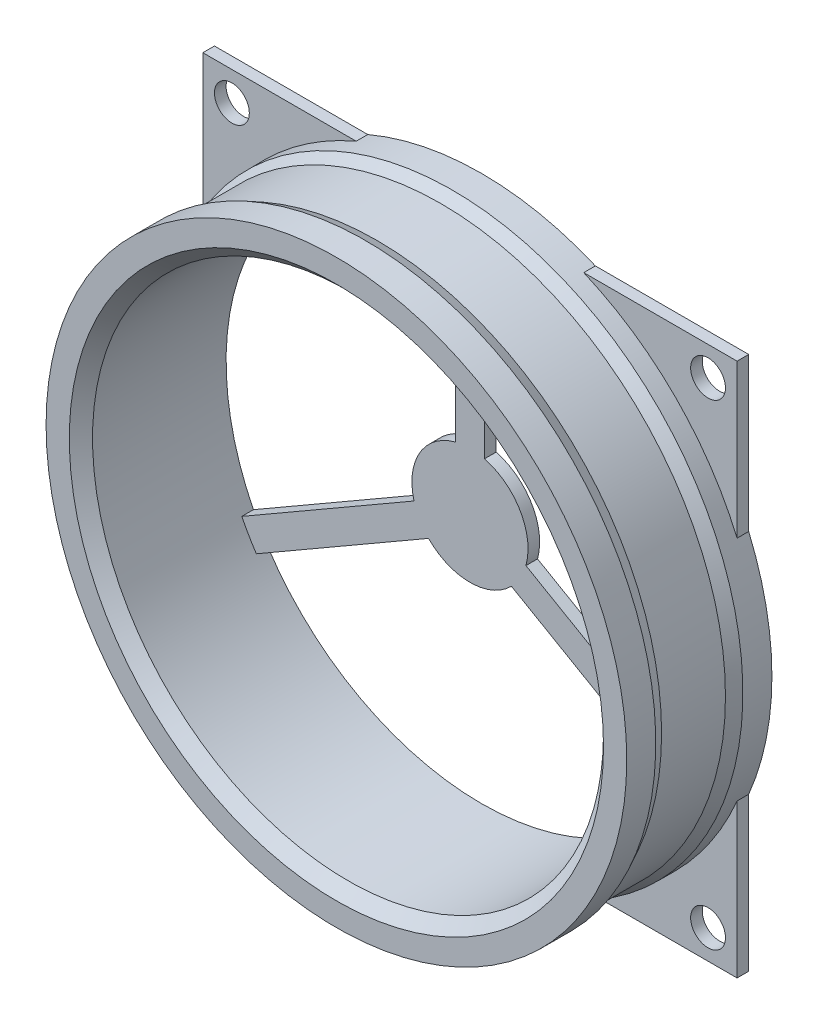
ISO-10303-21;
HEADER;
FILE_DESCRIPTION(('STEP AP214'),'2;1');
FILE_NAME('part.step','',(''),(''),'','','');
FILE_SCHEMA(('AUTOMOTIVE_DESIGN { 1 0 10303 214 1 1 1 1 }'));
ENDSEC;
DATA;
#1=APPLICATION_CONTEXT('core data for automotive mechanical design processes');
#2=APPLICATION_PROTOCOL_DEFINITION('international standard','automotive_design',2000,#1);
#3=PRODUCT_CONTEXT('',#1,'mechanical');
#4=PRODUCT('Part','Part','',(#3));
#5=PRODUCT_RELATED_PRODUCT_CATEGORY('part','',(#4));
#6=PRODUCT_DEFINITION_FORMATION('','',#4);
#7=PRODUCT_DEFINITION_CONTEXT('part definition',#1,'design');
#8=PRODUCT_DEFINITION('design','',#6,#7);
#9=PRODUCT_DEFINITION_SHAPE('','',#8);
#10=(LENGTH_UNIT() NAMED_UNIT(*) SI_UNIT(.MILLI.,.METRE.));
#11=(NAMED_UNIT(*) PLANE_ANGLE_UNIT() SI_UNIT($,.RADIAN.));
#12=(NAMED_UNIT(*) SI_UNIT($,.STERADIAN.) SOLID_ANGLE_UNIT());
#13=UNCERTAINTY_MEASURE_WITH_UNIT(LENGTH_MEASURE(1.E-05),#10,'distance_accuracy_value','');
#14=(GEOMETRIC_REPRESENTATION_CONTEXT(3) GLOBAL_UNCERTAINTY_ASSIGNED_CONTEXT((#13)) GLOBAL_UNIT_ASSIGNED_CONTEXT((#10,
#11,#12)) REPRESENTATION_CONTEXT('',''));
#15=CARTESIAN_POINT('',(0.,0.,0.));
#16=DIRECTION('',(0.,0.,1.));
#17=DIRECTION('',(1.,0.,0.));
#18=AXIS2_PLACEMENT_3D('',#15,#16,#17);
#19=CARTESIAN_POINT('',(0.,0.,25.));
#20=DIRECTION('',(0.,0.,-1.));
#21=DIRECTION('',(-1.,0.,0.));
#22=AXIS2_PLACEMENT_3D('',#19,#20,#21);
#23=CYLINDRICAL_SURFACE('',#22,50.);
#24=CARTESIAN_POINT('',(0.,0.,5.));
#25=DIRECTION('',(0.,0.,-1.));
#26=DIRECTION('',(-1.,0.,0.));
#27=AXIS2_PLACEMENT_3D('',#24,#25,#26);
#28=CIRCLE('',#27,50.);
#29=CARTESIAN_POINT('',(-50.,0.,5.));
#30=VERTEX_POINT('',#29);
#31=EDGE_CURVE('E677',#30,#30,#28,.T.);
#32=ORIENTED_EDGE('',*,*,#31,.T.);
#33=EDGE_LOOP('',(#32));
#34=FACE_BOUND('',#33,.T.);
#35=CARTESIAN_POINT('',(0.,0.,0.));
#36=DIRECTION('',(0.,0.,1.));
#37=DIRECTION('',(1.,0.,0.));
#38=AXIS2_PLACEMENT_3D('',#35,#36,#37);
#39=CIRCLE('',#38,50.);
#40=CARTESIAN_POINT('',(46.,-19.5959179422654,0.));
#41=VERTEX_POINT('',#40);
#42=CARTESIAN_POINT('',(46.,19.5959179422654,0.));
#43=VERTEX_POINT('',#42);
#44=EDGE_CURVE('E739',#41,#43,#39,.T.);
#45=ORIENTED_EDGE('',*,*,#44,.T.);
#46=DIRECTION('',(0.,0.,-1.));
#47=VECTOR('',#46,1.);
#48=CARTESIAN_POINT('',(46.,19.5959179422654,2.));
#49=LINE('',#48,#47);
#50=CARTESIAN_POINT('',(46.,19.5959179422654,2.));
#51=VERTEX_POINT('',#50);
#52=EDGE_CURVE('E435',#51,#43,#49,.T.);
#53=ORIENTED_EDGE('',*,*,#52,.F.);
#54=CARTESIAN_POINT('',(0.,0.,2.));
#55=DIRECTION('',(0.,0.,1.));
#56=DIRECTION('',(1.,0.,0.));
#57=AXIS2_PLACEMENT_3D('',#54,#55,#56);
#58=CIRCLE('',#57,50.);
#59=CARTESIAN_POINT('',(19.5959179422655,46.,2.));
#60=VERTEX_POINT('',#59);
#61=EDGE_CURVE('E420',#51,#60,#58,.T.);
#62=ORIENTED_EDGE('',*,*,#61,.T.);
#63=DIRECTION('',(0.,0.,-1.));
#64=VECTOR('',#63,1.);
#65=CARTESIAN_POINT('',(19.5959179422655,46.,2.));
#66=LINE('',#65,#64);
#67=CARTESIAN_POINT('',(19.5959179422655,46.,0.));
#68=VERTEX_POINT('',#67);
#69=EDGE_CURVE('E427',#60,#68,#66,.T.);
#70=ORIENTED_EDGE('',*,*,#69,.T.);
#71=CARTESIAN_POINT('',(-19.5959179422655,46.,0.));
#72=VERTEX_POINT('',#71);
#73=EDGE_CURVE('E491',#68,#72,#39,.T.);
#74=ORIENTED_EDGE('',*,*,#73,.T.);
#75=DIRECTION('',(0.,0.,-1.));
#76=VECTOR('',#75,1.);
#77=CARTESIAN_POINT('',(-19.5959179422655,46.,2.));
#78=LINE('',#77,#76);
#79=CARTESIAN_POINT('',(-19.5959179422655,46.,2.));
#80=VERTEX_POINT('',#79);
#81=EDGE_CURVE('E510',#80,#72,#78,.T.);
#82=ORIENTED_EDGE('',*,*,#81,.F.);
#83=CARTESIAN_POINT('',(0.,0.,2.));
#84=DIRECTION('',(0.,0.,1.));
#85=DIRECTION('',(1.,0.,0.));
#86=AXIS2_PLACEMENT_3D('',#83,#84,#85);
#87=CIRCLE('',#86,50.);
#88=CARTESIAN_POINT('',(-46.,19.5959179422655,2.));
#89=VERTEX_POINT('',#88);
#90=EDGE_CURVE('E492',#80,#89,#87,.T.);
#91=ORIENTED_EDGE('',*,*,#90,.T.);
#92=DIRECTION('',(0.,0.,-1.));
#93=VECTOR('',#92,1.);
#94=CARTESIAN_POINT('',(-46.,19.5959179422655,2.));
#95=LINE('',#94,#93);
#96=CARTESIAN_POINT('',(-46.,19.5959179422655,0.));
#97=VERTEX_POINT('',#96);
#98=EDGE_CURVE('E501',#89,#97,#95,.T.);
#99=ORIENTED_EDGE('',*,*,#98,.T.);
#100=CARTESIAN_POINT('',(-46.,-19.5959179422655,0.));
#101=VERTEX_POINT('',#100);
#102=EDGE_CURVE('E485',#97,#101,#39,.T.);
#103=ORIENTED_EDGE('',*,*,#102,.T.);
#104=DIRECTION('',(0.,0.,-1.));
#105=VECTOR('',#104,1.);
#106=CARTESIAN_POINT('',(-46.,-19.5959179422655,2.));
#107=LINE('',#106,#105);
#108=CARTESIAN_POINT('',(-46.,-19.5959179422655,2.));
#109=VERTEX_POINT('',#108);
#110=EDGE_CURVE('E477',#109,#101,#107,.T.);
#111=ORIENTED_EDGE('',*,*,#110,.F.);
#112=CARTESIAN_POINT('',(0.,0.,2.));
#113=DIRECTION('',(0.,0.,1.));
#114=DIRECTION('',(1.,0.,0.));
#115=AXIS2_PLACEMENT_3D('',#112,#113,#114);
#116=CIRCLE('',#115,50.);
#117=CARTESIAN_POINT('',(-19.5959179422654,-46.,2.));
#118=VERTEX_POINT('',#117);
#119=EDGE_CURVE('E460',#109,#118,#116,.T.);
#120=ORIENTED_EDGE('',*,*,#119,.T.);
#121=DIRECTION('',(0.,0.,-1.));
#122=VECTOR('',#121,1.);
#123=CARTESIAN_POINT('',(-19.5959179422654,-46.,2.));
#124=LINE('',#123,#122);
#125=CARTESIAN_POINT('',(-19.5959179422654,-46.,0.));
#126=VERTEX_POINT('',#125);
#127=EDGE_CURVE('E468',#118,#126,#124,.T.);
#128=ORIENTED_EDGE('',*,*,#127,.T.);
#129=CARTESIAN_POINT('',(19.5959179422654,-46.,0.));
#130=VERTEX_POINT('',#129);
#131=EDGE_CURVE('E490',#126,#130,#39,.T.);
#132=ORIENTED_EDGE('',*,*,#131,.T.);
#133=DIRECTION('',(0.,0.,-1.));
#134=VECTOR('',#133,1.);
#135=CARTESIAN_POINT('',(19.5959179422654,-46.,2.));
#136=LINE('',#135,#134);
#137=CARTESIAN_POINT('',(19.5959179422654,-46.,2.));
#138=VERTEX_POINT('',#137);
#139=EDGE_CURVE('E456',#138,#130,#136,.T.);
#140=ORIENTED_EDGE('',*,*,#139,.F.);
#141=CARTESIAN_POINT('',(0.,0.,2.));
#142=DIRECTION('',(0.,0.,1.));
#143=DIRECTION('',(1.,0.,0.));
#144=AXIS2_PLACEMENT_3D('',#141,#142,#143);
#145=CIRCLE('',#144,50.);
#146=CARTESIAN_POINT('',(46.,-19.5959179422654,2.));
#147=VERTEX_POINT('',#146);
#148=EDGE_CURVE('E439',#138,#147,#145,.T.);
#149=ORIENTED_EDGE('',*,*,#148,.T.);
#150=DIRECTION('',(0.,0.,-1.));
#151=VECTOR('',#150,1.);
#152=CARTESIAN_POINT('',(46.,-19.5959179422654,2.));
#153=LINE('',#152,#151);
#154=EDGE_CURVE('E447',#147,#41,#153,.T.);
#155=ORIENTED_EDGE('',*,*,#154,.T.);
#156=EDGE_LOOP('',(#45,#53,#62,#70,#74,#82,#91,#99,#103,#111,#120,#128,#132,#140,#149,#155));
#157=FACE_BOUND('',#156,.T.);
#158=ADVANCED_FACE('F221',(#34,#157),#23,.T.);
#159=CARTESIAN_POINT('',(0.,0.,25.));
#160=DIRECTION('',(0.,0.,-1.));
#161=DIRECTION('',(-1.,0.,0.));
#162=AXIS2_PLACEMENT_3D('',#159,#160,#161);
#163=CYLINDRICAL_SURFACE('',#162,44.);
#164=CARTESIAN_POINT('',(0.,0.,23.));
#165=DIRECTION('',(0.,0.,1.));
#166=DIRECTION('',(1.,0.,0.));
#167=AXIS2_PLACEMENT_3D('',#164,#165,#166);
#168=CIRCLE('',#167,44.);
#169=CARTESIAN_POINT('',(44.,0.,23.));
#170=VERTEX_POINT('',#169);
#171=EDGE_CURVE('E230',#170,#170,#168,.T.);
#172=ORIENTED_EDGE('',*,*,#171,.T.);
#173=EDGE_LOOP('',(#172));
#174=FACE_BOUND('',#173,.T.);
#175=CARTESIAN_POINT('',(0.,0.,2.));
#176=DIRECTION('',(0.,0.,1.));
#177=DIRECTION('',(1.,0.,0.));
#178=AXIS2_PLACEMENT_3D('',#175,#176,#177);
#179=CIRCLE('',#178,44.);
#180=CARTESIAN_POINT('',(2.5,43.9289198592454,2.));
#181=VERTEX_POINT('',#180);
#182=CARTESIAN_POINT('',(-2.5,43.9289198592454,2.));
#183=VERTEX_POINT('',#182);
#184=EDGE_CURVE('E397',#181,#183,#179,.T.);
#185=ORIENTED_EDGE('',*,*,#184,.F.);
#186=DIRECTION('',(0.,0.,-1.));
#187=VECTOR('',#186,1.);
#188=CARTESIAN_POINT('',(2.5,43.9289198592454,2.));
#189=LINE('',#188,#187);
#190=CARTESIAN_POINT('',(2.5,43.9289198592454,0.));
#191=VERTEX_POINT('',#190);
#192=EDGE_CURVE('E394',#181,#191,#189,.T.);
#193=ORIENTED_EDGE('',*,*,#192,.T.);
#194=CARTESIAN_POINT('',(0.,0.,0.));
#195=DIRECTION('',(0.,0.,1.));
#196=DIRECTION('',(1.,0.,0.));
#197=AXIS2_PLACEMENT_3D('',#194,#195,#196);
#198=CIRCLE('',#197,44.);
#199=CARTESIAN_POINT('',(39.2935605589172,-19.7993964201616,0.));
#200=VERTEX_POINT('',#199);
#201=EDGE_CURVE('E480',#200,#191,#198,.T.);
#202=ORIENTED_EDGE('',*,*,#201,.F.);
#203=DIRECTION('',(0.,0.,-1.));
#204=VECTOR('',#203,1.);
#205=CARTESIAN_POINT('',(39.2935605589172,-19.7993964201616,2.));
#206=LINE('',#205,#204);
#207=CARTESIAN_POINT('',(39.2935605589172,-19.7993964201616,2.));
#208=VERTEX_POINT('',#207);
#209=EDGE_CURVE('E710',#208,#200,#206,.T.);
#210=ORIENTED_EDGE('',*,*,#209,.F.);
#211=CARTESIAN_POINT('',(0.,0.,2.));
#212=DIRECTION('',(0.,0.,1.));
#213=DIRECTION('',(1.,0.,0.));
#214=AXIS2_PLACEMENT_3D('',#211,#212,#213);
#215=CIRCLE('',#214,44.);
#216=CARTESIAN_POINT('',(36.7935605589172,-24.1295234390838,2.));
#217=VERTEX_POINT('',#216);
#218=EDGE_CURVE('E692',#217,#208,#215,.T.);
#219=ORIENTED_EDGE('',*,*,#218,.F.);
#220=DIRECTION('',(0.,0.,-1.));
#221=VECTOR('',#220,1.);
#222=CARTESIAN_POINT('',(36.7935605589172,-24.1295234390838,2.));
#223=LINE('',#222,#221);
#224=CARTESIAN_POINT('',(36.7935605589172,-24.1295234390838,0.));
#225=VERTEX_POINT('',#224);
#226=EDGE_CURVE('E712',#217,#225,#223,.T.);
#227=ORIENTED_EDGE('',*,*,#226,.T.);
#228=CARTESIAN_POINT('',(-36.7935605589172,-24.1295234390838,0.));
#229=VERTEX_POINT('',#228);
#230=EDGE_CURVE('E487',#229,#225,#198,.T.);
#231=ORIENTED_EDGE('',*,*,#230,.F.);
#232=DIRECTION('',(0.,0.,-1.));
#233=VECTOR('',#232,1.);
#234=CARTESIAN_POINT('',(-36.7935605589172,-24.1295234390838,2.));
#235=LINE('',#234,#233);
#236=CARTESIAN_POINT('',(-36.7935605589172,-24.1295234390838,2.));
#237=VERTEX_POINT('',#236);
#238=EDGE_CURVE('E720',#237,#229,#235,.T.);
#239=ORIENTED_EDGE('',*,*,#238,.F.);
#240=CARTESIAN_POINT('',(0.,0.,2.));
#241=DIRECTION('',(0.,0.,1.));
#242=DIRECTION('',(1.,0.,0.));
#243=AXIS2_PLACEMENT_3D('',#240,#241,#242);
#244=CIRCLE('',#243,44.);
#245=CARTESIAN_POINT('',(-39.2935605589172,-19.7993964201616,2.));
#246=VERTEX_POINT('',#245);
#247=EDGE_CURVE('E685',#246,#237,#244,.T.);
#248=ORIENTED_EDGE('',*,*,#247,.F.);
#249=DIRECTION('',(0.,0.,-1.));
#250=VECTOR('',#249,1.);
#251=CARTESIAN_POINT('',(-39.2935605589172,-19.7993964201616,2.));
#252=LINE('',#251,#250);
#253=CARTESIAN_POINT('',(-39.2935605589172,-19.7993964201616,0.));
#254=VERTEX_POINT('',#253);
#255=EDGE_CURVE('E722',#246,#254,#252,.T.);
#256=ORIENTED_EDGE('',*,*,#255,.T.);
#257=CARTESIAN_POINT('',(-2.5,43.9289198592454,0.));
#258=VERTEX_POINT('',#257);
#259=EDGE_CURVE('E488',#258,#254,#198,.T.);
#260=ORIENTED_EDGE('',*,*,#259,.F.);
#261=DIRECTION('',(0.,0.,-1.));
#262=VECTOR('',#261,1.);
#263=CARTESIAN_POINT('',(-2.5,43.9289198592454,2.));
#264=LINE('',#263,#262);
#265=EDGE_CURVE('E416',#183,#258,#264,.T.);
#266=ORIENTED_EDGE('',*,*,#265,.F.);
#267=EDGE_LOOP('',(#185,#193,#202,#210,#219,#227,#231,#239,#248,#256,#260,#266));
#268=FACE_BOUND('',#267,.T.);
#269=ADVANCED_FACE('F516',(#174,#268),#163,.F.);
#270=CARTESIAN_POINT('',(0.,0.,20.));
#271=DIRECTION('',(0.,0.,-1.));
#272=DIRECTION('',(-1.,0.,0.));
#273=AXIS2_PLACEMENT_3D('',#270,#271,#272);
#274=CIRCLE('',#273,50.);
#275=CARTESIAN_POINT('',(-50.,0.,20.));
#276=VERTEX_POINT('',#275);
#277=EDGE_CURVE('E556',#276,#276,#274,.T.);
#278=ORIENTED_EDGE('',*,*,#277,.F.);
#279=EDGE_LOOP('',(#278));
#280=FACE_BOUND('',#279,.T.);
#281=CARTESIAN_POINT('',(0.,0.,25.));
#282=DIRECTION('',(0.,0.,1.));
#283=DIRECTION('',(1.,0.,0.));
#284=AXIS2_PLACEMENT_3D('',#281,#282,#283);
#285=CIRCLE('',#284,50.);
#286=CARTESIAN_POINT('',(50.,0.,25.));
#287=VERTEX_POINT('',#286);
#288=EDGE_CURVE('E481',#287,#287,#285,.T.);
#289=ORIENTED_EDGE('',*,*,#288,.F.);
#290=EDGE_LOOP('',(#289));
#291=FACE_BOUND('',#290,.T.);
#292=ADVANCED_FACE('F537',(#280,#291),#23,.T.);
#293=CARTESIAN_POINT('',(0.,46.,2.));
#294=DIRECTION('',(0.,1.,0.));
#295=DIRECTION('',(0.,0.,1.));
#296=AXIS2_PLACEMENT_3D('',#293,#294,#295);
#297=PLANE('',#296);
#298=DIRECTION('',(1.,0.,0.));
#299=VECTOR('',#298,1.);
#300=CARTESIAN_POINT('',(0.,46.,0.));
#301=LINE('',#300,#299);
#302=CARTESIAN_POINT('',(-46.,46.,0.));
#303=VERTEX_POINT('',#302);
#304=EDGE_CURVE('E484',#303,#72,#301,.T.);
#305=ORIENTED_EDGE('',*,*,#304,.F.);
#306=DIRECTION('',(0.,0.,-1.));
#307=VECTOR('',#306,1.);
#308=CARTESIAN_POINT('',(-46.,46.,2.));
#309=LINE('',#308,#307);
#310=CARTESIAN_POINT('',(-46.,46.,2.));
#311=VERTEX_POINT('',#310);
#312=EDGE_CURVE('E508',#311,#303,#309,.T.);
#313=ORIENTED_EDGE('',*,*,#312,.F.);
#314=DIRECTION('',(1.,0.,0.));
#315=VECTOR('',#314,1.);
#316=CARTESIAN_POINT('',(0.,46.,2.));
#317=LINE('',#316,#315);
#318=EDGE_CURVE('E494',#311,#80,#317,.T.);
#319=ORIENTED_EDGE('',*,*,#318,.T.);
#320=ORIENTED_EDGE('',*,*,#81,.T.);
#321=EDGE_LOOP('',(#305,#313,#319,#320));
#322=FACE_BOUND('',#321,.T.);
#323=ADVANCED_FACE('F546',(#322),#297,.T.);
#324=CARTESIAN_POINT('',(-46.,0.,2.));
#325=DIRECTION('',(1.,0.,0.));
#326=DIRECTION('',(0.,1.,0.));
#327=AXIS2_PLACEMENT_3D('',#324,#325,#326);
#328=PLANE('',#327);
#329=DIRECTION('',(0.,-1.,0.));
#330=VECTOR('',#329,1.);
#331=CARTESIAN_POINT('',(-46.,0.,0.));
#332=LINE('',#331,#330);
#333=EDGE_CURVE('E495',#303,#97,#332,.T.);
#334=ORIENTED_EDGE('',*,*,#333,.T.);
#335=ORIENTED_EDGE('',*,*,#98,.F.);
#336=DIRECTION('',(0.,-1.,0.));
#337=VECTOR('',#336,1.);
#338=CARTESIAN_POINT('',(-46.,0.,2.));
#339=LINE('',#338,#337);
#340=EDGE_CURVE('E498',#311,#89,#339,.T.);
#341=ORIENTED_EDGE('',*,*,#340,.F.);
#342=ORIENTED_EDGE('',*,*,#312,.T.);
#343=EDGE_LOOP('',(#334,#335,#341,#342));
#344=FACE_BOUND('',#343,.T.);
#345=ADVANCED_FACE('F551',(#344),#328,.F.);
#346=CARTESIAN_POINT('',(0.,0.,2.));
#347=DIRECTION('',(0.,0.,1.));
#348=DIRECTION('',(1.,0.,0.));
#349=AXIS2_PLACEMENT_3D('',#346,#347,#348);
#350=PLANE('',#349);
#351=CARTESIAN_POINT('',(-41.,41.,2.));
#352=DIRECTION('',(0.,0.,1.));
#353=DIRECTION('',(1.,0.,0.));
#354=AXIS2_PLACEMENT_3D('',#351,#352,#353);
#355=CIRCLE('',#354,3.);
#356=CARTESIAN_POINT('',(-38.,41.,2.));
#357=VERTEX_POINT('',#356);
#358=EDGE_CURVE('E1030',#357,#357,#355,.T.);
#359=ORIENTED_EDGE('',*,*,#358,.F.);
#360=EDGE_LOOP('',(#359));
#361=FACE_BOUND('',#360,.T.);
#362=ORIENTED_EDGE('',*,*,#90,.F.);
#363=ORIENTED_EDGE('',*,*,#318,.F.);
#364=ORIENTED_EDGE('',*,*,#340,.T.);
#365=EDGE_LOOP('',(#362,#363,#364));
#366=FACE_BOUND('',#365,.T.);
#367=ADVANCED_FACE('F571',(#361,#366),#350,.T.);
#368=CARTESIAN_POINT('',(0.,0.,0.));
#369=DIRECTION('',(0.,0.,1.));
#370=DIRECTION('',(1.,0.,0.));
#371=AXIS2_PLACEMENT_3D('',#368,#369,#370);
#372=PLANE('',#371);
#373=CARTESIAN_POINT('',(41.,41.,0.));
#374=DIRECTION('',(0.,0.,1.));
#375=DIRECTION('',(1.,0.,0.));
#376=AXIS2_PLACEMENT_3D('',#373,#374,#375);
#377=CIRCLE('',#376,3.);
#378=CARTESIAN_POINT('',(44.,41.,0.));
#379=VERTEX_POINT('',#378);
#380=EDGE_CURVE('E667',#379,#379,#377,.T.);
#381=ORIENTED_EDGE('',*,*,#380,.T.);
#382=EDGE_LOOP('',(#381));
#383=FACE_BOUND('',#382,.T.);
#384=CARTESIAN_POINT('',(41.,-41.,0.));
#385=DIRECTION('',(0.,0.,1.));
#386=DIRECTION('',(1.,0.,0.));
#387=AXIS2_PLACEMENT_3D('',#384,#385,#386);
#388=CIRCLE('',#387,3.);
#389=CARTESIAN_POINT('',(44.,-41.,0.));
#390=VERTEX_POINT('',#389);
#391=EDGE_CURVE('E662',#390,#390,#388,.T.);
#392=ORIENTED_EDGE('',*,*,#391,.T.);
#393=EDGE_LOOP('',(#392));
#394=FACE_BOUND('',#393,.T.);
#395=CARTESIAN_POINT('',(-41.,-41.,0.));
#396=DIRECTION('',(0.,0.,1.));
#397=DIRECTION('',(1.,0.,0.));
#398=AXIS2_PLACEMENT_3D('',#395,#396,#397);
#399=CIRCLE('',#398,3.);
#400=CARTESIAN_POINT('',(-38.,-41.,0.));
#401=VERTEX_POINT('',#400);
#402=EDGE_CURVE('E660',#401,#401,#399,.T.);
#403=ORIENTED_EDGE('',*,*,#402,.T.);
#404=EDGE_LOOP('',(#403));
#405=FACE_BOUND('',#404,.T.);
#406=CARTESIAN_POINT('',(-41.,41.,0.));
#407=DIRECTION('',(0.,0.,1.));
#408=DIRECTION('',(1.,0.,0.));
#409=AXIS2_PLACEMENT_3D('',#406,#407,#408);
#410=CIRCLE('',#409,3.);
#411=CARTESIAN_POINT('',(-38.,41.,0.));
#412=VERTEX_POINT('',#411);
#413=EDGE_CURVE('E225',#412,#412,#410,.T.);
#414=ORIENTED_EDGE('',*,*,#413,.T.);
#415=EDGE_LOOP('',(#414));
#416=FACE_BOUND('',#415,.T.);
#417=DIRECTION('',(0.,1.,0.));
#418=VECTOR('',#417,1.);
#419=CARTESIAN_POINT('',(-2.5,0.,0.));
#420=LINE('',#419,#418);
#421=CARTESIAN_POINT('',(-2.5,9.68245836551855,0.));
#422=VERTEX_POINT('',#421);
#423=EDGE_CURVE('E701',#422,#258,#420,.T.);
#424=ORIENTED_EDGE('',*,*,#423,.T.);
#425=ORIENTED_EDGE('',*,*,#259,.T.);
#426=DIRECTION('',(-0.866025403784438,-0.5,0.));
#427=VECTOR('',#426,1.);
#428=CARTESIAN_POINT('',(-1.25,2.1650635094611,0.));
#429=LINE('',#428,#427);
#430=CARTESIAN_POINT('',(-9.63525491562421,-2.67616567329818,0.));
#431=VERTEX_POINT('',#430);
#432=EDGE_CURVE('E703',#431,#254,#429,.T.);
#433=ORIENTED_EDGE('',*,*,#432,.F.);
#434=CARTESIAN_POINT('',(0.,0.,0.));
#435=DIRECTION('',(0.,0.,1.));
#436=DIRECTION('',(1.,0.,0.));
#437=AXIS2_PLACEMENT_3D('',#434,#435,#436);
#438=CIRCLE('',#437,10.);
#439=EDGE_CURVE('E699',#422,#431,#438,.T.);
#440=ORIENTED_EDGE('',*,*,#439,.F.);
#441=EDGE_LOOP('',(#424,#425,#433,#440));
#442=FACE_BOUND('',#441,.T.);
#443=DIRECTION('',(-0.866025403784438,-0.5,0.));
#444=VECTOR('',#443,1.);
#445=CARTESIAN_POINT('',(1.25,-2.1650635094611,0.));
#446=LINE('',#445,#444);
#447=CARTESIAN_POINT('',(-7.13525491562421,-7.00629269222037,0.));
#448=VERTEX_POINT('',#447);
#449=EDGE_CURVE('E245',#448,#229,#446,.T.);
#450=ORIENTED_EDGE('',*,*,#449,.T.);
#451=ORIENTED_EDGE('',*,*,#230,.T.);
#452=DIRECTION('',(0.866025403784439,-0.5,0.));
#453=VECTOR('',#452,1.);
#454=CARTESIAN_POINT('',(-1.25,-2.1650635094611,0.));
#455=LINE('',#454,#453);
#456=CARTESIAN_POINT('',(7.13525491562421,-7.00629269222036,0.));
#457=VERTEX_POINT('',#456);
#458=EDGE_CURVE('E706',#457,#225,#455,.T.);
#459=ORIENTED_EDGE('',*,*,#458,.F.);
#460=EDGE_CURVE('E698',#448,#457,#438,.T.);
#461=ORIENTED_EDGE('',*,*,#460,.F.);
#462=EDGE_LOOP('',(#450,#451,#459,#461));
#463=FACE_BOUND('',#462,.T.);
#464=ORIENTED_EDGE('',*,*,#304,.T.);
#465=ORIENTED_EDGE('',*,*,#73,.F.);
#466=DIRECTION('',(1.,0.,0.));
#467=VECTOR('',#466,1.);
#468=CARTESIAN_POINT('',(0.,46.,0.));
#469=LINE('',#468,#467);
#470=CARTESIAN_POINT('',(46.,46.,0.));
#471=VERTEX_POINT('',#470);
#472=EDGE_CURVE('E414',#68,#471,#469,.T.);
#473=ORIENTED_EDGE('',*,*,#472,.T.);
#474=DIRECTION('',(0.,-1.,0.));
#475=VECTOR('',#474,1.);
#476=CARTESIAN_POINT('',(46.,0.,0.));
#477=LINE('',#476,#475);
#478=EDGE_CURVE('E411',#471,#43,#477,.T.);
#479=ORIENTED_EDGE('',*,*,#478,.T.);
#480=ORIENTED_EDGE('',*,*,#44,.F.);
#481=DIRECTION('',(0.,-1.,0.));
#482=VECTOR('',#481,1.);
#483=CARTESIAN_POINT('',(46.,0.,0.));
#484=LINE('',#483,#482);
#485=CARTESIAN_POINT('',(46.,-46.,0.));
#486=VERTEX_POINT('',#485);
#487=EDGE_CURVE('E442',#41,#486,#484,.T.);
#488=ORIENTED_EDGE('',*,*,#487,.T.);
#489=DIRECTION('',(1.,0.,0.));
#490=VECTOR('',#489,1.);
#491=CARTESIAN_POINT('',(0.,-46.,0.));
#492=LINE('',#491,#490);
#493=EDGE_CURVE('E438',#130,#486,#492,.T.);
#494=ORIENTED_EDGE('',*,*,#493,.F.);
#495=ORIENTED_EDGE('',*,*,#131,.F.);
#496=DIRECTION('',(1.,0.,0.));
#497=VECTOR('',#496,1.);
#498=CARTESIAN_POINT('',(0.,-46.,0.));
#499=LINE('',#498,#497);
#500=CARTESIAN_POINT('',(-46.,-46.,0.));
#501=VERTEX_POINT('',#500);
#502=EDGE_CURVE('E463',#501,#126,#499,.T.);
#503=ORIENTED_EDGE('',*,*,#502,.F.);
#504=DIRECTION('',(0.,-1.,0.));
#505=VECTOR('',#504,1.);
#506=CARTESIAN_POINT('',(-46.,0.,0.));
#507=LINE('',#506,#505);
#508=EDGE_CURVE('E459',#101,#501,#507,.T.);
#509=ORIENTED_EDGE('',*,*,#508,.F.);
#510=ORIENTED_EDGE('',*,*,#102,.F.);
#511=ORIENTED_EDGE('',*,*,#333,.F.);
#512=EDGE_LOOP('',(#464,#465,#473,#479,#480,#488,#494,#495,#503,#509,#510,#511));
#513=FACE_BOUND('',#512,.T.);
#514=ORIENTED_EDGE('',*,*,#201,.T.);
#515=DIRECTION('',(0.,1.,0.));
#516=VECTOR('',#515,1.);
#517=CARTESIAN_POINT('',(2.5,0.,0.));
#518=LINE('',#517,#516);
#519=CARTESIAN_POINT('',(2.5,9.68245836551855,0.));
#520=VERTEX_POINT('',#519);
#521=EDGE_CURVE('E697',#520,#191,#518,.T.);
#522=ORIENTED_EDGE('',*,*,#521,.F.);
#523=CARTESIAN_POINT('',(9.63525491562421,-2.67616567329817,0.));
#524=VERTEX_POINT('',#523);
#525=EDGE_CURVE('E410',#524,#520,#438,.T.);
#526=ORIENTED_EDGE('',*,*,#525,.F.);
#527=DIRECTION('',(0.866025403784439,-0.5,0.));
#528=VECTOR('',#527,1.);
#529=CARTESIAN_POINT('',(1.25,2.1650635094611,0.));
#530=LINE('',#529,#528);
#531=EDGE_CURVE('E237',#524,#200,#530,.T.);
#532=ORIENTED_EDGE('',*,*,#531,.T.);
#533=EDGE_LOOP('',(#514,#522,#526,#532));
#534=FACE_BOUND('',#533,.T.);
#535=ADVANCED_FACE('F562',(#383,#394,#405,#416,#442,#463,#513,#534),#372,.F.);
#536=CARTESIAN_POINT('',(0.,0.,25.));
#537=DIRECTION('',(0.,0.,1.));
#538=DIRECTION('',(1.,0.,0.));
#539=AXIS2_PLACEMENT_3D('',#536,#537,#538);
#540=PLANE('',#539);
#541=CARTESIAN_POINT('',(0.,0.,25.));
#542=DIRECTION('',(0.,0.,1.));
#543=DIRECTION('',(1.,0.,0.));
#544=AXIS2_PLACEMENT_3D('',#541,#542,#543);
#545=CIRCLE('',#544,46.);
#546=CARTESIAN_POINT('',(46.,0.,25.));
#547=VERTEX_POINT('',#546);
#548=EDGE_CURVE('E12',#547,#547,#545,.F.);
#549=ORIENTED_EDGE('',*,*,#548,.T.);
#550=EDGE_LOOP('',(#549));
#551=FACE_BOUND('',#550,.T.);
#552=ORIENTED_EDGE('',*,*,#288,.T.);
#553=EDGE_LOOP('',(#552));
#554=FACE_BOUND('',#553,.T.);
#555=ADVANCED_FACE('F559',(#551,#554),#540,.T.);
#556=CARTESIAN_POINT('',(-46.,0.,2.));
#557=DIRECTION('',(1.,0.,0.));
#558=DIRECTION('',(0.,1.,0.));
#559=AXIS2_PLACEMENT_3D('',#556,#557,#558);
#560=PLANE('',#559);
#561=ORIENTED_EDGE('',*,*,#508,.T.);
#562=DIRECTION('',(0.,0.,-1.));
#563=VECTOR('',#562,1.);
#564=CARTESIAN_POINT('',(-46.,-46.,2.));
#565=LINE('',#564,#563);
#566=CARTESIAN_POINT('',(-46.,-46.,2.));
#567=VERTEX_POINT('',#566);
#568=EDGE_CURVE('E474',#567,#501,#565,.T.);
#569=ORIENTED_EDGE('',*,*,#568,.F.);
#570=DIRECTION('',(0.,-1.,0.));
#571=VECTOR('',#570,1.);
#572=CARTESIAN_POINT('',(-46.,0.,2.));
#573=LINE('',#572,#571);
#574=EDGE_CURVE('E462',#109,#567,#573,.T.);
#575=ORIENTED_EDGE('',*,*,#574,.F.);
#576=ORIENTED_EDGE('',*,*,#110,.T.);
#577=EDGE_LOOP('',(#561,#569,#575,#576));
#578=FACE_BOUND('',#577,.T.);
#579=ADVANCED_FACE('F561',(#578),#560,.F.);
#580=CARTESIAN_POINT('',(0.,-46.,2.));
#581=DIRECTION('',(0.,1.,0.));
#582=DIRECTION('',(0.,0.,1.));
#583=AXIS2_PLACEMENT_3D('',#580,#581,#582);
#584=PLANE('',#583);
#585=ORIENTED_EDGE('',*,*,#502,.T.);
#586=ORIENTED_EDGE('',*,*,#127,.F.);
#587=DIRECTION('',(1.,0.,0.));
#588=VECTOR('',#587,1.);
#589=CARTESIAN_POINT('',(0.,-46.,2.));
#590=LINE('',#589,#588);
#591=EDGE_CURVE('E465',#567,#118,#590,.T.);
#592=ORIENTED_EDGE('',*,*,#591,.F.);
#593=ORIENTED_EDGE('',*,*,#568,.T.);
#594=EDGE_LOOP('',(#585,#586,#592,#593));
#595=FACE_BOUND('',#594,.T.);
#596=ADVANCED_FACE('F568',(#595),#584,.F.);
#597=CARTESIAN_POINT('',(0.,0.,2.));
#598=DIRECTION('',(0.,0.,1.));
#599=DIRECTION('',(1.,0.,0.));
#600=AXIS2_PLACEMENT_3D('',#597,#598,#599);
#601=PLANE('',#600);
#602=CARTESIAN_POINT('',(-41.,-41.,2.));
#603=DIRECTION('',(0.,0.,1.));
#604=DIRECTION('',(1.,0.,0.));
#605=AXIS2_PLACEMENT_3D('',#602,#603,#604);
#606=CIRCLE('',#605,3.);
#607=CARTESIAN_POINT('',(-38.,-41.,2.));
#608=VERTEX_POINT('',#607);
#609=EDGE_CURVE('E657',#608,#608,#606,.T.);
#610=ORIENTED_EDGE('',*,*,#609,.F.);
#611=EDGE_LOOP('',(#610));
#612=FACE_BOUND('',#611,.T.);
#613=ORIENTED_EDGE('',*,*,#119,.F.);
#614=ORIENTED_EDGE('',*,*,#574,.T.);
#615=ORIENTED_EDGE('',*,*,#591,.T.);
#616=EDGE_LOOP('',(#613,#614,#615));
#617=FACE_BOUND('',#616,.T.);
#618=ADVANCED_FACE('F577',(#612,#617),#601,.T.);
#619=CARTESIAN_POINT('',(0.,-46.,2.));
#620=DIRECTION('',(0.,1.,0.));
#621=DIRECTION('',(0.,0.,1.));
#622=AXIS2_PLACEMENT_3D('',#619,#620,#621);
#623=PLANE('',#622);
#624=ORIENTED_EDGE('',*,*,#493,.T.);
#625=DIRECTION('',(0.,0.,-1.));
#626=VECTOR('',#625,1.);
#627=CARTESIAN_POINT('',(46.,-46.,2.));
#628=LINE('',#627,#626);
#629=CARTESIAN_POINT('',(46.,-46.,2.));
#630=VERTEX_POINT('',#629);
#631=EDGE_CURVE('E454',#630,#486,#628,.T.);
#632=ORIENTED_EDGE('',*,*,#631,.F.);
#633=DIRECTION('',(1.,0.,0.));
#634=VECTOR('',#633,1.);
#635=CARTESIAN_POINT('',(0.,-46.,2.));
#636=LINE('',#635,#634);
#637=EDGE_CURVE('E441',#138,#630,#636,.T.);
#638=ORIENTED_EDGE('',*,*,#637,.F.);
#639=ORIENTED_EDGE('',*,*,#139,.T.);
#640=EDGE_LOOP('',(#624,#632,#638,#639));
#641=FACE_BOUND('',#640,.T.);
#642=ADVANCED_FACE('F581',(#641),#623,.F.);
#643=CARTESIAN_POINT('',(46.,0.,2.));
#644=DIRECTION('',(1.,0.,0.));
#645=DIRECTION('',(0.,1.,0.));
#646=AXIS2_PLACEMENT_3D('',#643,#644,#645);
#647=PLANE('',#646);
#648=ORIENTED_EDGE('',*,*,#487,.F.);
#649=ORIENTED_EDGE('',*,*,#154,.F.);
#650=DIRECTION('',(0.,-1.,0.));
#651=VECTOR('',#650,1.);
#652=CARTESIAN_POINT('',(46.,0.,2.));
#653=LINE('',#652,#651);
#654=EDGE_CURVE('E444',#147,#630,#653,.T.);
#655=ORIENTED_EDGE('',*,*,#654,.T.);
#656=ORIENTED_EDGE('',*,*,#631,.T.);
#657=EDGE_LOOP('',(#648,#649,#655,#656));
#658=FACE_BOUND('',#657,.T.);
#659=ADVANCED_FACE('F585',(#658),#647,.T.);
#660=CARTESIAN_POINT('',(0.,0.,2.));
#661=DIRECTION('',(0.,0.,1.));
#662=DIRECTION('',(1.,0.,0.));
#663=AXIS2_PLACEMENT_3D('',#660,#661,#662);
#664=PLANE('',#663);
#665=CARTESIAN_POINT('',(41.,-41.,2.));
#666=DIRECTION('',(0.,0.,1.));
#667=DIRECTION('',(1.,0.,0.));
#668=AXIS2_PLACEMENT_3D('',#665,#666,#667);
#669=CIRCLE('',#668,3.);
#670=CARTESIAN_POINT('',(44.,-41.,2.));
#671=VERTEX_POINT('',#670);
#672=EDGE_CURVE('E1033',#671,#671,#669,.T.);
#673=ORIENTED_EDGE('',*,*,#672,.F.);
#674=EDGE_LOOP('',(#673));
#675=FACE_BOUND('',#674,.T.);
#676=ORIENTED_EDGE('',*,*,#148,.F.);
#677=ORIENTED_EDGE('',*,*,#637,.T.);
#678=ORIENTED_EDGE('',*,*,#654,.F.);
#679=EDGE_LOOP('',(#676,#677,#678));
#680=FACE_BOUND('',#679,.T.);
#681=ADVANCED_FACE('F589',(#675,#680),#664,.T.);
#682=CARTESIAN_POINT('',(46.,0.,2.));
#683=DIRECTION('',(1.,0.,0.));
#684=DIRECTION('',(0.,1.,0.));
#685=AXIS2_PLACEMENT_3D('',#682,#683,#684);
#686=PLANE('',#685);
#687=ORIENTED_EDGE('',*,*,#478,.F.);
#688=DIRECTION('',(0.,0.,-1.));
#689=VECTOR('',#688,1.);
#690=CARTESIAN_POINT('',(46.,46.,2.));
#691=LINE('',#690,#689);
#692=CARTESIAN_POINT('',(46.,46.,2.));
#693=VERTEX_POINT('',#692);
#694=EDGE_CURVE('E433',#693,#471,#691,.T.);
#695=ORIENTED_EDGE('',*,*,#694,.F.);
#696=DIRECTION('',(0.,-1.,0.));
#697=VECTOR('',#696,1.);
#698=CARTESIAN_POINT('',(46.,0.,2.));
#699=LINE('',#698,#697);
#700=EDGE_CURVE('E422',#693,#51,#699,.T.);
#701=ORIENTED_EDGE('',*,*,#700,.T.);
#702=ORIENTED_EDGE('',*,*,#52,.T.);
#703=EDGE_LOOP('',(#687,#695,#701,#702));
#704=FACE_BOUND('',#703,.T.);
#705=ADVANCED_FACE('F593',(#704),#686,.T.);
#706=CARTESIAN_POINT('',(0.,46.,2.));
#707=DIRECTION('',(0.,1.,0.));
#708=DIRECTION('',(0.,0.,1.));
#709=AXIS2_PLACEMENT_3D('',#706,#707,#708);
#710=PLANE('',#709);
#711=ORIENTED_EDGE('',*,*,#472,.F.);
#712=ORIENTED_EDGE('',*,*,#69,.F.);
#713=DIRECTION('',(1.,0.,0.));
#714=VECTOR('',#713,1.);
#715=CARTESIAN_POINT('',(0.,46.,2.));
#716=LINE('',#715,#714);
#717=EDGE_CURVE('E425',#60,#693,#716,.T.);
#718=ORIENTED_EDGE('',*,*,#717,.T.);
#719=ORIENTED_EDGE('',*,*,#694,.T.);
#720=EDGE_LOOP('',(#711,#712,#718,#719));
#721=FACE_BOUND('',#720,.T.);
#722=ADVANCED_FACE('F597',(#721),#710,.T.);
#723=CARTESIAN_POINT('',(0.,0.,2.));
#724=DIRECTION('',(0.,0.,1.));
#725=DIRECTION('',(1.,0.,0.));
#726=AXIS2_PLACEMENT_3D('',#723,#724,#725);
#727=PLANE('',#726);
#728=CARTESIAN_POINT('',(41.,41.,2.));
#729=DIRECTION('',(0.,0.,1.));
#730=DIRECTION('',(1.,0.,0.));
#731=AXIS2_PLACEMENT_3D('',#728,#729,#730);
#732=CIRCLE('',#731,3.);
#733=CARTESIAN_POINT('',(44.,41.,2.));
#734=VERTEX_POINT('',#733);
#735=EDGE_CURVE('E1036',#734,#734,#732,.T.);
#736=ORIENTED_EDGE('',*,*,#735,.F.);
#737=EDGE_LOOP('',(#736));
#738=FACE_BOUND('',#737,.T.);
#739=ORIENTED_EDGE('',*,*,#61,.F.);
#740=ORIENTED_EDGE('',*,*,#700,.F.);
#741=ORIENTED_EDGE('',*,*,#717,.F.);
#742=EDGE_LOOP('',(#739,#740,#741));
#743=FACE_BOUND('',#742,.T.);
#744=ADVANCED_FACE('F601',(#738,#743),#727,.T.);
#745=CARTESIAN_POINT('',(0.,0.,2.));
#746=DIRECTION('',(0.,0.,-1.));
#747=DIRECTION('',(-1.,0.,0.));
#748=AXIS2_PLACEMENT_3D('',#745,#746,#747);
#749=CYLINDRICAL_SURFACE('',#748,10.);
#750=ORIENTED_EDGE('',*,*,#525,.T.);
#751=DIRECTION('',(0.,0.,-1.));
#752=VECTOR('',#751,1.);
#753=CARTESIAN_POINT('',(2.5,9.68245836551855,2.));
#754=LINE('',#753,#752);
#755=CARTESIAN_POINT('',(2.5,9.68245836551855,2.));
#756=VERTEX_POINT('',#755);
#757=EDGE_CURVE('E391',#756,#520,#754,.T.);
#758=ORIENTED_EDGE('',*,*,#757,.F.);
#759=CARTESIAN_POINT('',(0.,0.,2.));
#760=DIRECTION('',(0.,0.,1.));
#761=DIRECTION('',(1.,0.,0.));
#762=AXIS2_PLACEMENT_3D('',#759,#760,#761);
#763=CIRCLE('',#762,10.);
#764=CARTESIAN_POINT('',(9.63525491562421,-2.67616567329817,2.));
#765=VERTEX_POINT('',#764);
#766=EDGE_CURVE('E398',#765,#756,#763,.T.);
#767=ORIENTED_EDGE('',*,*,#766,.F.);
#768=DIRECTION('',(0.,0.,-1.));
#769=VECTOR('',#768,1.);
#770=CARTESIAN_POINT('',(9.63525491562421,-2.67616567329817,2.));
#771=LINE('',#770,#769);
#772=EDGE_CURVE('E695',#765,#524,#771,.T.);
#773=ORIENTED_EDGE('',*,*,#772,.T.);
#774=EDGE_LOOP('',(#750,#758,#767,#773));
#775=FACE_BOUND('',#774,.T.);
#776=ADVANCED_FACE('F409',(#775),#749,.T.);
#777=CARTESIAN_POINT('',(2.5,0.,2.));
#778=DIRECTION('',(-1.,0.,0.));
#779=DIRECTION('',(0.,0.,1.));
#780=AXIS2_PLACEMENT_3D('',#777,#778,#779);
#781=PLANE('',#780);
#782=ORIENTED_EDGE('',*,*,#521,.T.);
#783=ORIENTED_EDGE('',*,*,#192,.F.);
#784=DIRECTION('',(0.,1.,0.));
#785=VECTOR('',#784,1.);
#786=CARTESIAN_POINT('',(2.5,0.,2.));
#787=LINE('',#786,#785);
#788=EDGE_CURVE('E387',#756,#181,#787,.T.);
#789=ORIENTED_EDGE('',*,*,#788,.F.);
#790=ORIENTED_EDGE('',*,*,#757,.T.);
#791=EDGE_LOOP('',(#782,#783,#789,#790));
#792=FACE_BOUND('',#791,.T.);
#793=ADVANCED_FACE('F389',(#792),#781,.F.);
#794=CARTESIAN_POINT('',(-2.5,0.,2.));
#795=DIRECTION('',(-1.,0.,0.));
#796=DIRECTION('',(0.,0.,1.));
#797=AXIS2_PLACEMENT_3D('',#794,#795,#796);
#798=PLANE('',#797);
#799=ORIENTED_EDGE('',*,*,#423,.F.);
#800=DIRECTION('',(0.,0.,-1.));
#801=VECTOR('',#800,1.);
#802=CARTESIAN_POINT('',(-2.5,9.68245836551855,2.));
#803=LINE('',#802,#801);
#804=CARTESIAN_POINT('',(-2.5,9.68245836551855,2.));
#805=VERTEX_POINT('',#804);
#806=EDGE_CURVE('E728',#805,#422,#803,.T.);
#807=ORIENTED_EDGE('',*,*,#806,.F.);
#808=DIRECTION('',(0.,1.,0.));
#809=VECTOR('',#808,1.);
#810=CARTESIAN_POINT('',(-2.5,0.,2.));
#811=LINE('',#810,#809);
#812=EDGE_CURVE('E680',#805,#183,#811,.T.);
#813=ORIENTED_EDGE('',*,*,#812,.T.);
#814=ORIENTED_EDGE('',*,*,#265,.T.);
#815=EDGE_LOOP('',(#799,#807,#813,#814));
#816=FACE_BOUND('',#815,.T.);
#817=ADVANCED_FACE('F608',(#816),#798,.T.);
#818=ORIENTED_EDGE('',*,*,#439,.T.);
#819=DIRECTION('',(0.,0.,-1.));
#820=VECTOR('',#819,1.);
#821=CARTESIAN_POINT('',(-9.63525491562421,-2.67616567329818,2.));
#822=LINE('',#821,#820);
#823=CARTESIAN_POINT('',(-9.63525491562421,-2.67616567329818,2.));
#824=VERTEX_POINT('',#823);
#825=EDGE_CURVE('E725',#824,#431,#822,.T.);
#826=ORIENTED_EDGE('',*,*,#825,.F.);
#827=EDGE_CURVE('E408',#805,#824,#763,.T.);
#828=ORIENTED_EDGE('',*,*,#827,.F.);
#829=ORIENTED_EDGE('',*,*,#806,.T.);
#830=EDGE_LOOP('',(#818,#826,#828,#829));
#831=FACE_BOUND('',#830,.T.);
#832=ADVANCED_FACE('F611',(#831),#749,.T.);
#833=CARTESIAN_POINT('',(-1.25,2.1650635094611,2.));
#834=DIRECTION('',(0.5,-0.866025403784438,0.));
#835=DIRECTION('',(0.866025403784438,0.5,0.));
#836=AXIS2_PLACEMENT_3D('',#833,#834,#835);
#837=PLANE('',#836);
#838=ORIENTED_EDGE('',*,*,#432,.T.);
#839=ORIENTED_EDGE('',*,*,#255,.F.);
#840=DIRECTION('',(-0.866025403784438,-0.5,0.));
#841=VECTOR('',#840,1.);
#842=CARTESIAN_POINT('',(-1.25,2.1650635094611,2.));
#843=LINE('',#842,#841);
#844=EDGE_CURVE('E683',#824,#246,#843,.T.);
#845=ORIENTED_EDGE('',*,*,#844,.F.);
#846=ORIENTED_EDGE('',*,*,#825,.T.);
#847=EDGE_LOOP('',(#838,#839,#845,#846));
#848=FACE_BOUND('',#847,.T.);
#849=ADVANCED_FACE('F613',(#848),#837,.F.);
#850=CARTESIAN_POINT('',(1.25,-2.1650635094611,2.));
#851=DIRECTION('',(0.5,-0.866025403784438,0.));
#852=DIRECTION('',(0.866025403784438,0.5,0.));
#853=AXIS2_PLACEMENT_3D('',#850,#851,#852);
#854=PLANE('',#853);
#855=ORIENTED_EDGE('',*,*,#449,.F.);
#856=DIRECTION('',(0.,0.,-1.));
#857=VECTOR('',#856,1.);
#858=CARTESIAN_POINT('',(-7.13525491562421,-7.00629269222037,2.));
#859=LINE('',#858,#857);
#860=CARTESIAN_POINT('',(-7.13525491562421,-7.00629269222037,2.));
#861=VERTEX_POINT('',#860);
#862=EDGE_CURVE('E718',#861,#448,#859,.T.);
#863=ORIENTED_EDGE('',*,*,#862,.F.);
#864=DIRECTION('',(-0.866025403784438,-0.5,0.));
#865=VECTOR('',#864,1.);
#866=CARTESIAN_POINT('',(1.25,-2.1650635094611,2.));
#867=LINE('',#866,#865);
#868=EDGE_CURVE('E687',#861,#237,#867,.T.);
#869=ORIENTED_EDGE('',*,*,#868,.T.);
#870=ORIENTED_EDGE('',*,*,#238,.T.);
#871=EDGE_LOOP('',(#855,#863,#869,#870));
#872=FACE_BOUND('',#871,.T.);
#873=ADVANCED_FACE('F616',(#872),#854,.T.);
#874=ORIENTED_EDGE('',*,*,#460,.T.);
#875=DIRECTION('',(0.,0.,-1.));
#876=VECTOR('',#875,1.);
#877=CARTESIAN_POINT('',(7.13525491562421,-7.00629269222036,2.));
#878=LINE('',#877,#876);
#879=CARTESIAN_POINT('',(7.13525491562421,-7.00629269222036,2.));
#880=VERTEX_POINT('',#879);
#881=EDGE_CURVE('E715',#880,#457,#878,.T.);
#882=ORIENTED_EDGE('',*,*,#881,.F.);
#883=EDGE_CURVE('E407',#861,#880,#763,.T.);
#884=ORIENTED_EDGE('',*,*,#883,.F.);
#885=ORIENTED_EDGE('',*,*,#862,.T.);
#886=EDGE_LOOP('',(#874,#882,#884,#885));
#887=FACE_BOUND('',#886,.T.);
#888=ADVANCED_FACE('F620',(#887),#749,.T.);
#889=CARTESIAN_POINT('',(-1.25,-2.1650635094611,2.));
#890=DIRECTION('',(0.5,0.866025403784439,0.));
#891=DIRECTION('',(-0.866025403784439,0.5,0.));
#892=AXIS2_PLACEMENT_3D('',#889,#890,#891);
#893=PLANE('',#892);
#894=ORIENTED_EDGE('',*,*,#458,.T.);
#895=ORIENTED_EDGE('',*,*,#226,.F.);
#896=DIRECTION('',(0.866025403784439,-0.5,0.));
#897=VECTOR('',#896,1.);
#898=CARTESIAN_POINT('',(-1.25,-2.1650635094611,2.));
#899=LINE('',#898,#897);
#900=EDGE_CURVE('E690',#880,#217,#899,.T.);
#901=ORIENTED_EDGE('',*,*,#900,.F.);
#902=ORIENTED_EDGE('',*,*,#881,.T.);
#903=EDGE_LOOP('',(#894,#895,#901,#902));
#904=FACE_BOUND('',#903,.T.);
#905=ADVANCED_FACE('F624',(#904),#893,.F.);
#906=CARTESIAN_POINT('',(1.25,2.1650635094611,2.));
#907=DIRECTION('',(0.5,0.866025403784439,0.));
#908=DIRECTION('',(-0.866025403784439,0.5,0.));
#909=AXIS2_PLACEMENT_3D('',#906,#907,#908);
#910=PLANE('',#909);
#911=ORIENTED_EDGE('',*,*,#531,.F.);
#912=ORIENTED_EDGE('',*,*,#772,.F.);
#913=DIRECTION('',(0.866025403784439,-0.5,0.));
#914=VECTOR('',#913,1.);
#915=CARTESIAN_POINT('',(1.25,2.1650635094611,2.));
#916=LINE('',#915,#914);
#917=EDGE_CURVE('E404',#765,#208,#916,.T.);
#918=ORIENTED_EDGE('',*,*,#917,.T.);
#919=ORIENTED_EDGE('',*,*,#209,.T.);
#920=EDGE_LOOP('',(#911,#912,#918,#919));
#921=FACE_BOUND('',#920,.T.);
#922=ADVANCED_FACE('F628',(#921),#910,.T.);
#923=CARTESIAN_POINT('',(0.,0.,2.));
#924=DIRECTION('',(0.,0.,1.));
#925=DIRECTION('',(1.,0.,0.));
#926=AXIS2_PLACEMENT_3D('',#923,#924,#925);
#927=PLANE('',#926);
#928=ORIENTED_EDGE('',*,*,#766,.T.);
#929=ORIENTED_EDGE('',*,*,#788,.T.);
#930=ORIENTED_EDGE('',*,*,#184,.T.);
#931=ORIENTED_EDGE('',*,*,#812,.F.);
#932=ORIENTED_EDGE('',*,*,#827,.T.);
#933=ORIENTED_EDGE('',*,*,#844,.T.);
#934=ORIENTED_EDGE('',*,*,#247,.T.);
#935=ORIENTED_EDGE('',*,*,#868,.F.);
#936=ORIENTED_EDGE('',*,*,#883,.T.);
#937=ORIENTED_EDGE('',*,*,#900,.T.);
#938=ORIENTED_EDGE('',*,*,#218,.T.);
#939=ORIENTED_EDGE('',*,*,#917,.F.);
#940=EDGE_LOOP('',(#928,#929,#930,#931,#932,#933,#934,#935,#936,#937,#938,#939));
#941=FACE_BOUND('',#940,.T.);
#942=ADVANCED_FACE('F402',(#941),#927,.T.);
#943=CARTESIAN_POINT('',(0.,0.,7.));
#944=DIRECTION('',(0.,0.,-1.));
#945=DIRECTION('',(-1.,0.,0.));
#946=AXIS2_PLACEMENT_3D('',#943,#944,#945);
#947=CONICAL_SURFACE('',#946,49.,0.463647609000806);
#948=ORIENTED_EDGE('',*,*,#31,.F.);
#949=EDGE_LOOP('',(#948));
#950=FACE_BOUND('',#949,.T.);
#951=CARTESIAN_POINT('',(0.,0.,7.));
#952=DIRECTION('',(0.,0.,-1.));
#953=DIRECTION('',(-1.,0.,0.));
#954=AXIS2_PLACEMENT_3D('',#951,#952,#953);
#955=CIRCLE('',#954,49.);
#956=CARTESIAN_POINT('',(-49.,0.,7.));
#957=VERTEX_POINT('',#956);
#958=EDGE_CURVE('E665',#957,#957,#955,.T.);
#959=ORIENTED_EDGE('',*,*,#958,.T.);
#960=EDGE_LOOP('',(#959));
#961=FACE_BOUND('',#960,.T.);
#962=ADVANCED_FACE('F635',(#950,#961),#947,.T.);
#963=CARTESIAN_POINT('',(0.,0.,20.));
#964=DIRECTION('',(0.,0.,1.));
#965=DIRECTION('',(1.,0.,0.));
#966=AXIS2_PLACEMENT_3D('',#963,#964,#965);
#967=CONICAL_SURFACE('',#966,50.,0.463647609000806);
#968=CARTESIAN_POINT('',(0.,0.,18.));
#969=DIRECTION('',(0.,0.,-1.));
#970=DIRECTION('',(-1.,0.,0.));
#971=AXIS2_PLACEMENT_3D('',#968,#969,#970);
#972=CIRCLE('',#971,49.);
#973=CARTESIAN_POINT('',(-49.,0.,18.));
#974=VERTEX_POINT('',#973);
#975=EDGE_CURVE('E673',#974,#974,#972,.T.);
#976=ORIENTED_EDGE('',*,*,#975,.F.);
#977=EDGE_LOOP('',(#976));
#978=FACE_BOUND('',#977,.T.);
#979=ORIENTED_EDGE('',*,*,#277,.T.);
#980=EDGE_LOOP('',(#979));
#981=FACE_BOUND('',#980,.T.);
#982=ADVANCED_FACE('F530',(#978,#981),#967,.T.);
#983=CARTESIAN_POINT('',(0.,0.,-1.25));
#984=DIRECTION('',(0.,0.,-1.));
#985=DIRECTION('',(-1.,0.,0.));
#986=AXIS2_PLACEMENT_3D('',#983,#984,#985);
#987=CYLINDRICAL_SURFACE('',#986,49.);
#988=ORIENTED_EDGE('',*,*,#958,.F.);
#989=EDGE_LOOP('',(#988));
#990=FACE_BOUND('',#989,.T.);
#991=ORIENTED_EDGE('',*,*,#975,.T.);
#992=EDGE_LOOP('',(#991));
#993=FACE_BOUND('',#992,.T.);
#994=ADVANCED_FACE('F521',(#990,#993),#987,.T.);
#995=CARTESIAN_POINT('',(0.,0.,23.));
#996=DIRECTION('',(0.,0.,1.));
#997=DIRECTION('',(1.,0.,0.));
#998=AXIS2_PLACEMENT_3D('',#995,#996,#997);
#999=CONICAL_SURFACE('',#998,44.,0.785398163397445);
#1000=ORIENTED_EDGE('',*,*,#548,.F.);
#1001=EDGE_LOOP('',(#1000));
#1002=FACE_BOUND('',#1001,.T.);
#1003=ORIENTED_EDGE('',*,*,#171,.F.);
#1004=EDGE_LOOP('',(#1003));
#1005=FACE_BOUND('',#1004,.T.);
#1006=ADVANCED_FACE('F223',(#1002,#1005),#999,.F.);
#1007=CARTESIAN_POINT('',(41.,41.,-23.));
#1008=DIRECTION('',(0.,0.,1.));
#1009=DIRECTION('',(1.,0.,0.));
#1010=AXIS2_PLACEMENT_3D('',#1007,#1008,#1009);
#1011=CYLINDRICAL_SURFACE('',#1010,3.);
#1012=ORIENTED_EDGE('',*,*,#735,.T.);
#1013=EDGE_LOOP('',(#1012));
#1014=FACE_BOUND('',#1013,.T.);
#1015=ORIENTED_EDGE('',*,*,#380,.F.);
#1016=EDGE_LOOP('',(#1015));
#1017=FACE_BOUND('',#1016,.T.);
#1018=ADVANCED_FACE('F520',(#1014,#1017),#1011,.F.);
#1019=CARTESIAN_POINT('',(41.,-41.,-23.));
#1020=DIRECTION('',(0.,0.,1.));
#1021=DIRECTION('',(1.,0.,0.));
#1022=AXIS2_PLACEMENT_3D('',#1019,#1020,#1021);
#1023=CYLINDRICAL_SURFACE('',#1022,3.);
#1024=ORIENTED_EDGE('',*,*,#672,.T.);
#1025=EDGE_LOOP('',(#1024));
#1026=FACE_BOUND('',#1025,.T.);
#1027=ORIENTED_EDGE('',*,*,#391,.F.);
#1028=EDGE_LOOP('',(#1027));
#1029=FACE_BOUND('',#1028,.T.);
#1030=ADVANCED_FACE('F527',(#1026,#1029),#1023,.F.);
#1031=CARTESIAN_POINT('',(-41.,-41.,-23.));
#1032=DIRECTION('',(0.,0.,1.));
#1033=DIRECTION('',(1.,0.,0.));
#1034=AXIS2_PLACEMENT_3D('',#1031,#1032,#1033);
#1035=CYLINDRICAL_SURFACE('',#1034,3.);
#1036=ORIENTED_EDGE('',*,*,#609,.T.);
#1037=EDGE_LOOP('',(#1036));
#1038=FACE_BOUND('',#1037,.T.);
#1039=ORIENTED_EDGE('',*,*,#402,.F.);
#1040=EDGE_LOOP('',(#1039));
#1041=FACE_BOUND('',#1040,.T.);
#1042=ADVANCED_FACE('F644',(#1038,#1041),#1035,.F.);
#1043=CARTESIAN_POINT('',(-41.,41.,-23.));
#1044=DIRECTION('',(0.,0.,1.));
#1045=DIRECTION('',(1.,0.,0.));
#1046=AXIS2_PLACEMENT_3D('',#1043,#1044,#1045);
#1047=CYLINDRICAL_SURFACE('',#1046,3.);
#1048=ORIENTED_EDGE('',*,*,#358,.T.);
#1049=EDGE_LOOP('',(#1048));
#1050=FACE_BOUND('',#1049,.T.);
#1051=ORIENTED_EDGE('',*,*,#413,.F.);
#1052=EDGE_LOOP('',(#1051));
#1053=FACE_BOUND('',#1052,.T.);
#1054=ADVANCED_FACE('F642',(#1050,#1053),#1047,.F.);
#1055=CLOSED_SHELL('',(#158,#269,#292,#323,#345,#367,#535,#555,#579,#596,#618,#642,#659,#681,
#705,#722,#744,#776,#793,#817,#832,#849,#873,#888,#905,#922,#942,#962,#982,#994,#1006,#1018,
#1030,#1042,#1054));
#1056=MANIFOLD_SOLID_BREP('B2',#1055);
#1057=ADVANCED_BREP_SHAPE_REPRESENTATION('',(#18,#1056),#14);
#1058=SHAPE_DEFINITION_REPRESENTATION(#9,#1057);
ENDSEC;
END-ISO-10303-21;
